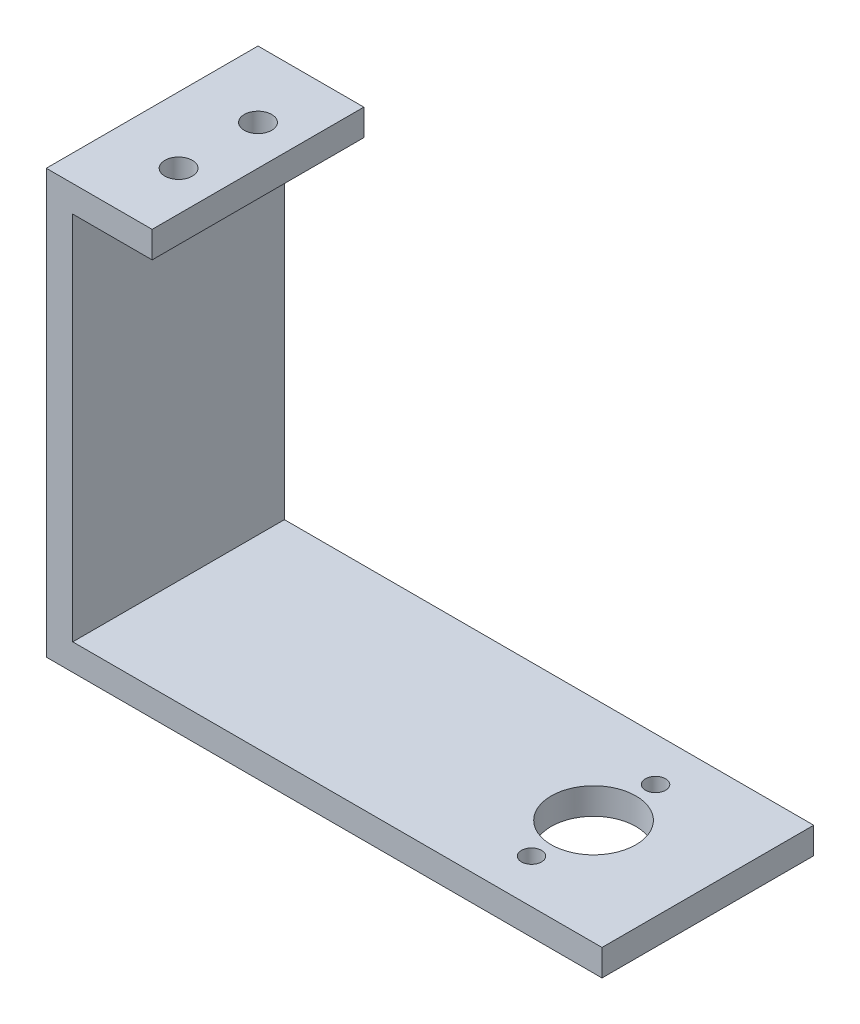
ISO-10303-21;
HEADER;
FILE_DESCRIPTION(('STEP AP214'),'2;1');
FILE_NAME('part.step','',(''),(''),'','','');
FILE_SCHEMA(('AUTOMOTIVE_DESIGN { 1 0 10303 214 1 1 1 1 }'));
ENDSEC;
DATA;
#1=APPLICATION_CONTEXT('core data for automotive mechanical design processes');
#2=APPLICATION_PROTOCOL_DEFINITION('international standard','automotive_design',2000,#1);
#3=PRODUCT_CONTEXT('',#1,'mechanical');
#4=PRODUCT('Part','Part','',(#3));
#5=PRODUCT_RELATED_PRODUCT_CATEGORY('part','',(#4));
#6=PRODUCT_DEFINITION_FORMATION('','',#4);
#7=PRODUCT_DEFINITION_CONTEXT('part definition',#1,'design');
#8=PRODUCT_DEFINITION('design','',#6,#7);
#9=PRODUCT_DEFINITION_SHAPE('','',#8);
#10=(LENGTH_UNIT() NAMED_UNIT(*) SI_UNIT(.MILLI.,.METRE.));
#11=(NAMED_UNIT(*) PLANE_ANGLE_UNIT() SI_UNIT($,.RADIAN.));
#12=(NAMED_UNIT(*) SI_UNIT($,.STERADIAN.) SOLID_ANGLE_UNIT());
#13=UNCERTAINTY_MEASURE_WITH_UNIT(LENGTH_MEASURE(1.E-05),#10,'distance_accuracy_value','');
#14=(GEOMETRIC_REPRESENTATION_CONTEXT(3) GLOBAL_UNCERTAINTY_ASSIGNED_CONTEXT((#13)) GLOBAL_UNIT_ASSIGNED_CONTEXT((#10,
#11,#12)) REPRESENTATION_CONTEXT('',''));
#15=CARTESIAN_POINT('',(0.,0.,0.));
#16=DIRECTION('',(0.,0.,1.));
#17=DIRECTION('',(1.,0.,0.));
#18=AXIS2_PLACEMENT_3D('',#15,#16,#17);
#19=CARTESIAN_POINT('',(-17.0592750793869,26.9872138550957,25.4));
#20=DIRECTION('',(-1.,0.,0.));
#21=DIRECTION('',(0.,0.,1.));
#22=AXIS2_PLACEMENT_3D('',#19,#20,#21);
#23=PLANE('',#22);
#24=DIRECTION('',(0.,1.,0.));
#25=VECTOR('',#24,1.);
#26=CARTESIAN_POINT('',(-17.0592750793869,26.9872138550957,0.));
#27=LINE('',#26,#25);
#28=CARTESIAN_POINT('',(-17.0592750793869,23.8122138550957,0.));
#29=VERTEX_POINT('',#28);
#30=CARTESIAN_POINT('',(-17.0592750793869,26.9872138550957,0.));
#31=VERTEX_POINT('',#30);
#32=EDGE_CURVE('E130',#29,#31,#27,.T.);
#33=ORIENTED_EDGE('',*,*,#32,.T.);
#34=DIRECTION('',(0.,0.,-1.));
#35=VECTOR('',#34,1.);
#36=CARTESIAN_POINT('',(-17.0592750793869,26.9872138550957,25.4));
#37=LINE('',#36,#35);
#38=CARTESIAN_POINT('',(-17.0592750793869,26.9872138550957,25.4));
#39=VERTEX_POINT('',#38);
#40=EDGE_CURVE('E11',#39,#31,#37,.T.);
#41=ORIENTED_EDGE('',*,*,#40,.F.);
#42=DIRECTION('',(0.,1.,0.));
#43=VECTOR('',#42,1.);
#44=CARTESIAN_POINT('',(-17.0592750793869,26.9872138550957,25.4));
#45=LINE('',#44,#43);
#46=CARTESIAN_POINT('',(-17.0592750793869,23.8122138550957,25.4));
#47=VERTEX_POINT('',#46);
#48=EDGE_CURVE('E144',#47,#39,#45,.T.);
#49=ORIENTED_EDGE('',*,*,#48,.F.);
#50=DIRECTION('',(0.,0.,-1.));
#51=VECTOR('',#50,1.);
#52=CARTESIAN_POINT('',(-17.0592750793869,23.8122138550957,25.4));
#53=LINE('',#52,#51);
#54=EDGE_CURVE('E126',#47,#29,#53,.T.);
#55=ORIENTED_EDGE('',*,*,#54,.T.);
#56=EDGE_LOOP('',(#33,#41,#49,#55));
#57=FACE_BOUND('',#56,.T.);
#58=ADVANCED_FACE('F33',(#57),#23,.F.);
#59=CARTESIAN_POINT('',(-17.0592750793869,26.9872138550957,25.4));
#60=DIRECTION('',(0.,-1.,0.));
#61=DIRECTION('',(1.,0.,0.));
#62=AXIS2_PLACEMENT_3D('',#59,#60,#61);
#63=PLANE('',#62);
#64=CARTESIAN_POINT('',(-21.8217750793869,26.9872138550957,7.9375));
#65=DIRECTION('',(0.,1.,0.));
#66=DIRECTION('',(0.,0.,1.));
#67=AXIS2_PLACEMENT_3D('',#64,#65,#66);
#68=CIRCLE('',#67,1.65);
#69=CARTESIAN_POINT('',(-21.8217750793869,26.9872138550957,9.5875));
#70=VERTEX_POINT('',#69);
#71=EDGE_CURVE('E184',#70,#70,#68,.T.);
#72=ORIENTED_EDGE('',*,*,#71,.F.);
#73=EDGE_LOOP('',(#72));
#74=FACE_BOUND('',#73,.T.);
#75=CARTESIAN_POINT('',(-21.8217750793869,26.9872138550957,17.4625));
#76=DIRECTION('',(0.,1.,0.));
#77=DIRECTION('',(0.,0.,1.));
#78=AXIS2_PLACEMENT_3D('',#75,#76,#77);
#79=CIRCLE('',#78,1.65);
#80=CARTESIAN_POINT('',(-21.8217750793869,26.9872138550957,19.1125));
#81=VERTEX_POINT('',#80);
#82=EDGE_CURVE('E178',#81,#81,#79,.T.);
#83=ORIENTED_EDGE('',*,*,#82,.F.);
#84=EDGE_LOOP('',(#83));
#85=FACE_BOUND('',#84,.T.);
#86=DIRECTION('',(-1.,0.,0.));
#87=VECTOR('',#86,1.);
#88=CARTESIAN_POINT('',(-17.0592750793869,26.9872138550957,0.));
#89=LINE('',#88,#87);
#90=CARTESIAN_POINT('',(-29.7592750793869,26.9872138550957,0.));
#91=VERTEX_POINT('',#90);
#92=EDGE_CURVE('E133',#31,#91,#89,.T.);
#93=ORIENTED_EDGE('',*,*,#92,.T.);
#94=DIRECTION('',(0.,0.,-1.));
#95=VECTOR('',#94,1.);
#96=CARTESIAN_POINT('',(-29.7592750793869,26.9872138550957,25.4));
#97=LINE('',#96,#95);
#98=CARTESIAN_POINT('',(-29.7592750793869,26.9872138550957,25.4));
#99=VERTEX_POINT('',#98);
#100=EDGE_CURVE('E42',#99,#91,#97,.T.);
#101=ORIENTED_EDGE('',*,*,#100,.F.);
#102=DIRECTION('',(-1.,0.,0.));
#103=VECTOR('',#102,1.);
#104=CARTESIAN_POINT('',(-17.0592750793869,26.9872138550957,25.4));
#105=LINE('',#104,#103);
#106=EDGE_CURVE('E93',#39,#99,#105,.T.);
#107=ORIENTED_EDGE('',*,*,#106,.F.);
#108=ORIENTED_EDGE('',*,*,#40,.T.);
#109=EDGE_LOOP('',(#93,#101,#107,#108));
#110=FACE_BOUND('',#109,.T.);
#111=ADVANCED_FACE('F237',(#74,#85,#110),#63,.F.);
#112=CARTESIAN_POINT('',(-29.7592750793869,26.9872138550957,25.4));
#113=DIRECTION('',(1.,0.,0.));
#114=DIRECTION('',(0.,1.,0.));
#115=AXIS2_PLACEMENT_3D('',#112,#113,#114);
#116=PLANE('',#115);
#117=DIRECTION('',(0.,-1.,0.));
#118=VECTOR('',#117,1.);
#119=CARTESIAN_POINT('',(-29.7592750793869,26.9872138550957,0.));
#120=LINE('',#119,#118);
#121=CARTESIAN_POINT('',(-29.7592750793869,-23.8127861449043,0.));
#122=VERTEX_POINT('',#121);
#123=EDGE_CURVE('E135',#91,#122,#120,.T.);
#124=ORIENTED_EDGE('',*,*,#123,.T.);
#125=DIRECTION('',(0.,0.,-1.));
#126=VECTOR('',#125,1.);
#127=CARTESIAN_POINT('',(-29.7592750793869,-23.8127861449043,25.4));
#128=LINE('',#127,#126);
#129=CARTESIAN_POINT('',(-29.7592750793869,-23.8127861449043,25.4));
#130=VERTEX_POINT('',#129);
#131=EDGE_CURVE('E151',#130,#122,#128,.T.);
#132=ORIENTED_EDGE('',*,*,#131,.F.);
#133=DIRECTION('',(0.,-1.,0.));
#134=VECTOR('',#133,1.);
#135=CARTESIAN_POINT('',(-29.7592750793869,26.9872138550957,25.4));
#136=LINE('',#135,#134);
#137=EDGE_CURVE('E160',#99,#130,#136,.T.);
#138=ORIENTED_EDGE('',*,*,#137,.F.);
#139=ORIENTED_EDGE('',*,*,#100,.T.);
#140=EDGE_LOOP('',(#124,#132,#138,#139));
#141=FACE_BOUND('',#140,.T.);
#142=ADVANCED_FACE('F158',(#141),#116,.F.);
#143=CARTESIAN_POINT('',(-29.7592750793869,-23.8127861449043,25.4));
#144=DIRECTION('',(0.,1.,0.));
#145=DIRECTION('',(-1.,0.,0.));
#146=AXIS2_PLACEMENT_3D('',#143,#144,#145);
#147=PLANE('',#146);
#148=CARTESIAN_POINT('',(23.1997249206131,-23.8127861449043,20.1422));
#149=DIRECTION('',(0.,-1.,0.));
#150=DIRECTION('',(0.,0.,-1.));
#151=AXIS2_PLACEMENT_3D('',#148,#149,#150);
#152=CIRCLE('',#151,1.2065);
#153=CARTESIAN_POINT('',(23.1997249206131,-23.8127861449043,18.9357));
#154=VERTEX_POINT('',#153);
#155=EDGE_CURVE('E202',#154,#154,#152,.T.);
#156=ORIENTED_EDGE('',*,*,#155,.F.);
#157=EDGE_LOOP('',(#156));
#158=FACE_BOUND('',#157,.T.);
#159=CARTESIAN_POINT('',(23.1997249206131,-23.8127861449043,5.2578));
#160=DIRECTION('',(0.,-1.,0.));
#161=DIRECTION('',(0.,0.,-1.));
#162=AXIS2_PLACEMENT_3D('',#159,#160,#161);
#163=CIRCLE('',#162,1.2065);
#164=CARTESIAN_POINT('',(23.1997249206131,-23.8127861449043,4.0513));
#165=VERTEX_POINT('',#164);
#166=EDGE_CURVE('E196',#165,#165,#163,.T.);
#167=ORIENTED_EDGE('',*,*,#166,.F.);
#168=EDGE_LOOP('',(#167));
#169=FACE_BOUND('',#168,.T.);
#170=CARTESIAN_POINT('',(23.1997249206131,-23.8127861449043,12.7));
#171=DIRECTION('',(0.,-1.,0.));
#172=DIRECTION('',(0.,0.,-1.));
#173=AXIS2_PLACEMENT_3D('',#170,#171,#172);
#174=CIRCLE('',#173,5.08);
#175=CARTESIAN_POINT('',(23.1997249206131,-23.8127861449043,7.62));
#176=VERTEX_POINT('',#175);
#177=EDGE_CURVE('E190',#176,#176,#174,.T.);
#178=ORIENTED_EDGE('',*,*,#177,.F.);
#179=EDGE_LOOP('',(#178));
#180=FACE_BOUND('',#179,.T.);
#181=DIRECTION('',(1.,0.,0.));
#182=VECTOR('',#181,1.);
#183=CARTESIAN_POINT('',(-29.7592750793869,-23.8127861449043,0.));
#184=LINE('',#183,#182);
#185=CARTESIAN_POINT('',(36.9157249206131,-23.8127861449043,0.));
#186=VERTEX_POINT('',#185);
#187=EDGE_CURVE('E137',#122,#186,#184,.T.);
#188=ORIENTED_EDGE('',*,*,#187,.T.);
#189=DIRECTION('',(0.,0.,-1.));
#190=VECTOR('',#189,1.);
#191=CARTESIAN_POINT('',(36.9157249206131,-23.8127861449043,25.4));
#192=LINE('',#191,#190);
#193=CARTESIAN_POINT('',(36.9157249206131,-23.8127861449043,25.4));
#194=VERTEX_POINT('',#193);
#195=EDGE_CURVE('E148',#194,#186,#192,.T.);
#196=ORIENTED_EDGE('',*,*,#195,.F.);
#197=DIRECTION('',(1.,0.,0.));
#198=VECTOR('',#197,1.);
#199=CARTESIAN_POINT('',(-29.7592750793869,-23.8127861449043,25.4));
#200=LINE('',#199,#198);
#201=EDGE_CURVE('E172',#130,#194,#200,.T.);
#202=ORIENTED_EDGE('',*,*,#201,.F.);
#203=ORIENTED_EDGE('',*,*,#131,.T.);
#204=EDGE_LOOP('',(#188,#196,#202,#203));
#205=FACE_BOUND('',#204,.T.);
#206=ADVANCED_FACE('F168',(#158,#169,#180,#205),#147,.F.);
#207=CARTESIAN_POINT('',(36.9157249206131,-23.8127861449043,25.4));
#208=DIRECTION('',(-1.,0.,0.));
#209=DIRECTION('',(0.,0.,1.));
#210=AXIS2_PLACEMENT_3D('',#207,#208,#209);
#211=PLANE('',#210);
#212=DIRECTION('',(0.,1.,0.));
#213=VECTOR('',#212,1.);
#214=CARTESIAN_POINT('',(36.9157249206131,-23.8127861449043,0.));
#215=LINE('',#214,#213);
#216=CARTESIAN_POINT('',(36.9157249206131,-20.6377861449043,0.));
#217=VERTEX_POINT('',#216);
#218=EDGE_CURVE('E139',#186,#217,#215,.T.);
#219=ORIENTED_EDGE('',*,*,#218,.T.);
#220=DIRECTION('',(0.,0.,-1.));
#221=VECTOR('',#220,1.);
#222=CARTESIAN_POINT('',(36.9157249206131,-20.6377861449043,25.4));
#223=LINE('',#222,#221);
#224=CARTESIAN_POINT('',(36.9157249206131,-20.6377861449043,25.4));
#225=VERTEX_POINT('',#224);
#226=EDGE_CURVE('E121',#225,#217,#223,.T.);
#227=ORIENTED_EDGE('',*,*,#226,.F.);
#228=DIRECTION('',(0.,1.,0.));
#229=VECTOR('',#228,1.);
#230=CARTESIAN_POINT('',(36.9157249206131,-23.8127861449043,25.4));
#231=LINE('',#230,#229);
#232=EDGE_CURVE('E112',#194,#225,#231,.T.);
#233=ORIENTED_EDGE('',*,*,#232,.F.);
#234=ORIENTED_EDGE('',*,*,#195,.T.);
#235=EDGE_LOOP('',(#219,#227,#233,#234));
#236=FACE_BOUND('',#235,.T.);
#237=ADVANCED_FACE('F171',(#236),#211,.F.);
#238=CARTESIAN_POINT('',(-26.5842750793869,-20.6377861449043,25.4));
#239=DIRECTION('',(0.,-1.,0.));
#240=DIRECTION('',(1.,0.,0.));
#241=AXIS2_PLACEMENT_3D('',#238,#239,#240);
#242=PLANE('',#241);
#243=CARTESIAN_POINT('',(23.1997249206131,-20.6377861449043,20.1422));
#244=DIRECTION('',(0.,-1.,0.));
#245=DIRECTION('',(1.,0.,0.));
#246=AXIS2_PLACEMENT_3D('',#243,#244,#245);
#247=CIRCLE('',#246,1.2065);
#248=CARTESIAN_POINT('',(24.4062249206131,-20.6377861449043,20.1422));
#249=VERTEX_POINT('',#248);
#250=EDGE_CURVE('E199',#249,#249,#247,.F.);
#251=ORIENTED_EDGE('',*,*,#250,.F.);
#252=EDGE_LOOP('',(#251));
#253=FACE_BOUND('',#252,.T.);
#254=CARTESIAN_POINT('',(23.1997249206131,-20.6377861449043,5.2578));
#255=DIRECTION('',(0.,-1.,0.));
#256=DIRECTION('',(1.,0.,0.));
#257=AXIS2_PLACEMENT_3D('',#254,#255,#256);
#258=CIRCLE('',#257,1.2065);
#259=CARTESIAN_POINT('',(24.4062249206131,-20.6377861449043,5.2578));
#260=VERTEX_POINT('',#259);
#261=EDGE_CURVE('E193',#260,#260,#258,.F.);
#262=ORIENTED_EDGE('',*,*,#261,.F.);
#263=EDGE_LOOP('',(#262));
#264=FACE_BOUND('',#263,.T.);
#265=CARTESIAN_POINT('',(23.1997249206131,-20.6377861449043,12.7));
#266=DIRECTION('',(0.,-1.,0.));
#267=DIRECTION('',(1.,0.,0.));
#268=AXIS2_PLACEMENT_3D('',#265,#266,#267);
#269=CIRCLE('',#268,5.08);
#270=CARTESIAN_POINT('',(28.2797249206131,-20.6377861449043,12.7));
#271=VERTEX_POINT('',#270);
#272=EDGE_CURVE('E187',#271,#271,#269,.F.);
#273=ORIENTED_EDGE('',*,*,#272,.F.);
#274=EDGE_LOOP('',(#273));
#275=FACE_BOUND('',#274,.T.);
#276=DIRECTION('',(-1.,0.,0.));
#277=VECTOR('',#276,1.);
#278=CARTESIAN_POINT('',(-26.5842750793869,-20.6377861449043,0.));
#279=LINE('',#278,#277);
#280=CARTESIAN_POINT('',(-26.5842750793869,-20.6377861449043,0.));
#281=VERTEX_POINT('',#280);
#282=EDGE_CURVE('E120',#217,#281,#279,.T.);
#283=ORIENTED_EDGE('',*,*,#282,.T.);
#284=DIRECTION('',(0.,0.,-1.));
#285=VECTOR('',#284,1.);
#286=CARTESIAN_POINT('',(-26.5842750793869,-20.6377861449043,25.4));
#287=LINE('',#286,#285);
#288=CARTESIAN_POINT('',(-26.5842750793869,-20.6377861449043,25.4));
#289=VERTEX_POINT('',#288);
#290=EDGE_CURVE('E117',#289,#281,#287,.T.);
#291=ORIENTED_EDGE('',*,*,#290,.F.);
#292=DIRECTION('',(-1.,0.,0.));
#293=VECTOR('',#292,1.);
#294=CARTESIAN_POINT('',(-26.5842750793869,-20.6377861449043,25.4));
#295=LINE('',#294,#293);
#296=EDGE_CURVE('E106',#225,#289,#295,.T.);
#297=ORIENTED_EDGE('',*,*,#296,.F.);
#298=ORIENTED_EDGE('',*,*,#226,.T.);
#299=EDGE_LOOP('',(#283,#291,#297,#298));
#300=FACE_BOUND('',#299,.T.);
#301=ADVANCED_FACE('F118',(#253,#264,#275,#300),#242,.F.);
#302=CARTESIAN_POINT('',(-26.5842750793869,23.8122138550957,25.4));
#303=DIRECTION('',(-1.,0.,0.));
#304=DIRECTION('',(0.,-1.,0.));
#305=AXIS2_PLACEMENT_3D('',#302,#303,#304);
#306=PLANE('',#305);
#307=DIRECTION('',(0.,1.,0.));
#308=VECTOR('',#307,1.);
#309=CARTESIAN_POINT('',(-26.5842750793869,23.8122138550957,0.));
#310=LINE('',#309,#308);
#311=CARTESIAN_POINT('',(-26.5842750793869,23.8122138550957,0.));
#312=VERTEX_POINT('',#311);
#313=EDGE_CURVE('E79',#281,#312,#310,.T.);
#314=ORIENTED_EDGE('',*,*,#313,.T.);
#315=DIRECTION('',(0.,0.,-1.));
#316=VECTOR('',#315,1.);
#317=CARTESIAN_POINT('',(-26.5842750793869,23.8122138550957,25.4));
#318=LINE('',#317,#316);
#319=CARTESIAN_POINT('',(-26.5842750793869,23.8122138550957,25.4));
#320=VERTEX_POINT('',#319);
#321=EDGE_CURVE('E122',#320,#312,#318,.T.);
#322=ORIENTED_EDGE('',*,*,#321,.F.);
#323=DIRECTION('',(0.,1.,0.));
#324=VECTOR('',#323,1.);
#325=CARTESIAN_POINT('',(-26.5842750793869,23.8122138550957,25.4));
#326=LINE('',#325,#324);
#327=EDGE_CURVE('E110',#289,#320,#326,.T.);
#328=ORIENTED_EDGE('',*,*,#327,.F.);
#329=ORIENTED_EDGE('',*,*,#290,.T.);
#330=EDGE_LOOP('',(#314,#322,#328,#329));
#331=FACE_BOUND('',#330,.T.);
#332=ADVANCED_FACE('F124',(#331),#306,.F.);
#333=CARTESIAN_POINT('',(-17.0592750793869,23.8122138550957,25.4));
#334=DIRECTION('',(0.,1.,0.));
#335=DIRECTION('',(0.,0.,1.));
#336=AXIS2_PLACEMENT_3D('',#333,#334,#335);
#337=PLANE('',#336);
#338=CARTESIAN_POINT('',(-21.8217750793869,23.8122138550957,7.9375));
#339=DIRECTION('',(0.,1.,0.));
#340=DIRECTION('',(0.,0.,1.));
#341=AXIS2_PLACEMENT_3D('',#338,#339,#340);
#342=CIRCLE('',#341,1.65);
#343=CARTESIAN_POINT('',(-21.8217750793869,23.8122138550957,9.5875));
#344=VERTEX_POINT('',#343);
#345=EDGE_CURVE('E181',#344,#344,#342,.T.);
#346=ORIENTED_EDGE('',*,*,#345,.T.);
#347=EDGE_LOOP('',(#346));
#348=FACE_BOUND('',#347,.T.);
#349=CARTESIAN_POINT('',(-21.8217750793869,23.8122138550957,17.4625));
#350=DIRECTION('',(0.,1.,0.));
#351=DIRECTION('',(0.,0.,1.));
#352=AXIS2_PLACEMENT_3D('',#349,#350,#351);
#353=CIRCLE('',#352,1.65);
#354=CARTESIAN_POINT('',(-21.8217750793869,23.8122138550957,19.1125));
#355=VERTEX_POINT('',#354);
#356=EDGE_CURVE('E36',#355,#355,#353,.T.);
#357=ORIENTED_EDGE('',*,*,#356,.T.);
#358=EDGE_LOOP('',(#357));
#359=FACE_BOUND('',#358,.T.);
#360=DIRECTION('',(1.,0.,0.));
#361=VECTOR('',#360,1.);
#362=CARTESIAN_POINT('',(-17.0592750793869,23.8122138550957,0.));
#363=LINE('',#362,#361);
#364=EDGE_CURVE('E85',#312,#29,#363,.T.);
#365=ORIENTED_EDGE('',*,*,#364,.T.);
#366=ORIENTED_EDGE('',*,*,#54,.F.);
#367=DIRECTION('',(1.,0.,0.));
#368=VECTOR('',#367,1.);
#369=CARTESIAN_POINT('',(-17.0592750793869,23.8122138550957,25.4));
#370=LINE('',#369,#368);
#371=EDGE_CURVE('E50',#320,#47,#370,.T.);
#372=ORIENTED_EDGE('',*,*,#371,.F.);
#373=ORIENTED_EDGE('',*,*,#321,.T.);
#374=EDGE_LOOP('',(#365,#366,#372,#373));
#375=FACE_BOUND('',#374,.T.);
#376=ADVANCED_FACE('F231',(#348,#359,#375),#337,.F.);
#377=CARTESIAN_POINT('',(0.,0.,25.4));
#378=DIRECTION('',(0.,0.,-1.));
#379=DIRECTION('',(-1.,0.,0.));
#380=AXIS2_PLACEMENT_3D('',#377,#378,#379);
#381=PLANE('',#380);
#382=ORIENTED_EDGE('',*,*,#48,.T.);
#383=ORIENTED_EDGE('',*,*,#106,.T.);
#384=ORIENTED_EDGE('',*,*,#137,.T.);
#385=ORIENTED_EDGE('',*,*,#201,.T.);
#386=ORIENTED_EDGE('',*,*,#232,.T.);
#387=ORIENTED_EDGE('',*,*,#296,.T.);
#388=ORIENTED_EDGE('',*,*,#327,.T.);
#389=ORIENTED_EDGE('',*,*,#371,.T.);
#390=EDGE_LOOP('',(#382,#383,#384,#385,#386,#387,#388,#389));
#391=FACE_BOUND('',#390,.T.);
#392=ADVANCED_FACE('F108',(#391),#381,.F.);
#393=CARTESIAN_POINT('',(0.,0.,0.));
#394=DIRECTION('',(0.,0.,-1.));
#395=DIRECTION('',(-1.,0.,0.));
#396=AXIS2_PLACEMENT_3D('',#393,#394,#395);
#397=PLANE('',#396);
#398=ORIENTED_EDGE('',*,*,#32,.F.);
#399=ORIENTED_EDGE('',*,*,#364,.F.);
#400=ORIENTED_EDGE('',*,*,#313,.F.);
#401=ORIENTED_EDGE('',*,*,#282,.F.);
#402=ORIENTED_EDGE('',*,*,#218,.F.);
#403=ORIENTED_EDGE('',*,*,#187,.F.);
#404=ORIENTED_EDGE('',*,*,#123,.F.);
#405=ORIENTED_EDGE('',*,*,#92,.F.);
#406=EDGE_LOOP('',(#398,#399,#400,#401,#402,#403,#404,#405));
#407=FACE_BOUND('',#406,.T.);
#408=ADVANCED_FACE('F164',(#407),#397,.T.);
#409=CARTESIAN_POINT('',(-21.8217750793869,26.9872138550957,17.4625));
#410=DIRECTION('',(0.,1.,0.));
#411=DIRECTION('',(0.,0.,1.));
#412=AXIS2_PLACEMENT_3D('',#409,#410,#411);
#413=CYLINDRICAL_SURFACE('',#412,1.65);
#414=ORIENTED_EDGE('',*,*,#82,.T.);
#415=EDGE_LOOP('',(#414));
#416=FACE_BOUND('',#415,.T.);
#417=ORIENTED_EDGE('',*,*,#356,.F.);
#418=EDGE_LOOP('',(#417));
#419=FACE_BOUND('',#418,.T.);
#420=ADVANCED_FACE('F255',(#416,#419),#413,.F.);
#421=CARTESIAN_POINT('',(-21.8217750793869,26.9872138550957,7.9375));
#422=DIRECTION('',(0.,1.,0.));
#423=DIRECTION('',(0.,0.,1.));
#424=AXIS2_PLACEMENT_3D('',#421,#422,#423);
#425=CYLINDRICAL_SURFACE('',#424,1.65);
#426=ORIENTED_EDGE('',*,*,#71,.T.);
#427=EDGE_LOOP('',(#426));
#428=FACE_BOUND('',#427,.T.);
#429=ORIENTED_EDGE('',*,*,#345,.F.);
#430=EDGE_LOOP('',(#429));
#431=FACE_BOUND('',#430,.T.);
#432=ADVANCED_FACE('F220',(#428,#431),#425,.F.);
#433=CARTESIAN_POINT('',(23.1997249206131,26.9882138550957,12.7));
#434=DIRECTION('',(0.,-1.,0.));
#435=DIRECTION('',(0.,0.,-1.));
#436=AXIS2_PLACEMENT_3D('',#433,#434,#435);
#437=CYLINDRICAL_SURFACE('',#436,5.08);
#438=ORIENTED_EDGE('',*,*,#177,.T.);
#439=EDGE_LOOP('',(#438));
#440=FACE_BOUND('',#439,.T.);
#441=ORIENTED_EDGE('',*,*,#272,.T.);
#442=EDGE_LOOP('',(#441));
#443=FACE_BOUND('',#442,.T.);
#444=ADVANCED_FACE('F216',(#440,#443),#437,.F.);
#445=CARTESIAN_POINT('',(23.1997249206131,26.9882138550957,5.2578));
#446=DIRECTION('',(0.,-1.,0.));
#447=DIRECTION('',(0.,0.,-1.));
#448=AXIS2_PLACEMENT_3D('',#445,#446,#447);
#449=CYLINDRICAL_SURFACE('',#448,1.2065);
#450=ORIENTED_EDGE('',*,*,#166,.T.);
#451=EDGE_LOOP('',(#450));
#452=FACE_BOUND('',#451,.T.);
#453=ORIENTED_EDGE('',*,*,#261,.T.);
#454=EDGE_LOOP('',(#453));
#455=FACE_BOUND('',#454,.T.);
#456=ADVANCED_FACE('F219',(#452,#455),#449,.F.);
#457=CARTESIAN_POINT('',(23.1997249206131,26.9882138550957,20.1422));
#458=DIRECTION('',(0.,-1.,0.));
#459=DIRECTION('',(0.,0.,-1.));
#460=AXIS2_PLACEMENT_3D('',#457,#458,#459);
#461=CYLINDRICAL_SURFACE('',#460,1.2065);
#462=ORIENTED_EDGE('',*,*,#155,.T.);
#463=EDGE_LOOP('',(#462));
#464=FACE_BOUND('',#463,.T.);
#465=ORIENTED_EDGE('',*,*,#250,.T.);
#466=EDGE_LOOP('',(#465));
#467=FACE_BOUND('',#466,.T.);
#468=ADVANCED_FACE('F206',(#464,#467),#461,.F.);
#469=CLOSED_SHELL('',(#58,#111,#142,#206,#237,#301,#332,#376,#392,#408,#420,#432,#444,#456,#468));
#470=MANIFOLD_SOLID_BREP('B2',#469);
#471=ADVANCED_BREP_SHAPE_REPRESENTATION('',(#18,#470),#14);
#472=SHAPE_DEFINITION_REPRESENTATION(#9,#471);
ENDSEC;
END-ISO-10303-21;
